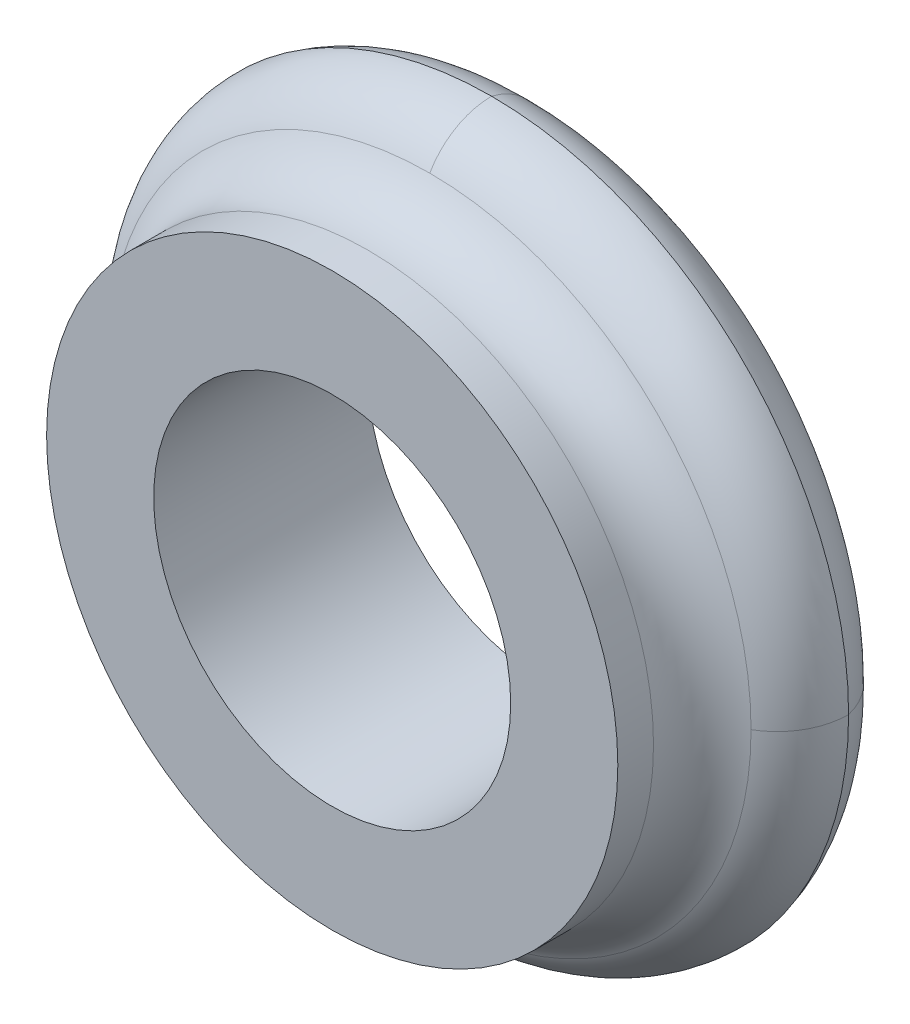
ISO-10303-21;
HEADER;
FILE_DESCRIPTION(('STEP AP214'),'2;1');
FILE_NAME('part.step','',(''),(''),'','','');
FILE_SCHEMA(('AUTOMOTIVE_DESIGN { 1 0 10303 214 1 1 1 1 }'));
ENDSEC;
DATA;
#1=APPLICATION_CONTEXT('core data for automotive mechanical design processes');
#2=APPLICATION_PROTOCOL_DEFINITION('international standard','automotive_design',2000,#1);
#3=PRODUCT_CONTEXT('',#1,'mechanical');
#4=PRODUCT('Part','Part','',(#3));
#5=PRODUCT_RELATED_PRODUCT_CATEGORY('part','',(#4));
#6=PRODUCT_DEFINITION_FORMATION('','',#4);
#7=PRODUCT_DEFINITION_CONTEXT('part definition',#1,'design');
#8=PRODUCT_DEFINITION('design','',#6,#7);
#9=PRODUCT_DEFINITION_SHAPE('','',#8);
#10=(LENGTH_UNIT() NAMED_UNIT(*) SI_UNIT(.MILLI.,.METRE.));
#11=(NAMED_UNIT(*) PLANE_ANGLE_UNIT() SI_UNIT($,.RADIAN.));
#12=(NAMED_UNIT(*) SI_UNIT($,.STERADIAN.) SOLID_ANGLE_UNIT());
#13=UNCERTAINTY_MEASURE_WITH_UNIT(LENGTH_MEASURE(1.E-05),#10,'distance_accuracy_value','');
#14=(GEOMETRIC_REPRESENTATION_CONTEXT(3) GLOBAL_UNCERTAINTY_ASSIGNED_CONTEXT((#13)) GLOBAL_UNIT_ASSIGNED_CONTEXT((#10,
#11,#12)) REPRESENTATION_CONTEXT('',''));
#15=CARTESIAN_POINT('',(0.,0.,0.));
#16=DIRECTION('',(0.,0.,1.));
#17=DIRECTION('',(1.,0.,0.));
#18=AXIS2_PLACEMENT_3D('',#15,#16,#17);
#19=CARTESIAN_POINT('',(0.,0.,3.));
#20=DIRECTION('',(0.,0.,-1.));
#21=DIRECTION('',(-1.,0.,0.));
#22=AXIS2_PLACEMENT_3D('',#19,#20,#21);
#23=CYLINDRICAL_SURFACE('',#22,2.5);
#24=CARTESIAN_POINT('',(0.,0.,3.));
#25=DIRECTION('',(0.,0.,1.));
#26=DIRECTION('',(1.,0.,0.));
#27=AXIS2_PLACEMENT_3D('',#24,#25,#26);
#28=CIRCLE('',#27,2.5);
#29=CARTESIAN_POINT('',(2.5,0.,3.));
#30=VERTEX_POINT('',#29);
#31=EDGE_CURVE('E174',#30,#30,#28,.T.);
#32=ORIENTED_EDGE('',*,*,#31,.T.);
#33=EDGE_LOOP('',(#32));
#34=FACE_BOUND('',#33,.T.);
#35=CARTESIAN_POINT('',(0.,0.,0.));
#36=DIRECTION('',(0.,0.,1.));
#37=DIRECTION('',(1.,0.,0.));
#38=AXIS2_PLACEMENT_3D('',#35,#36,#37);
#39=CIRCLE('',#38,2.5);
#40=CARTESIAN_POINT('',(2.5,0.,0.));
#41=VERTEX_POINT('',#40);
#42=EDGE_CURVE('E139',#41,#41,#39,.T.);
#43=ORIENTED_EDGE('',*,*,#42,.F.);
#44=EDGE_LOOP('',(#43));
#45=FACE_BOUND('',#44,.T.);
#46=ADVANCED_FACE('F41',(#34,#45),#23,.F.);
#47=CARTESIAN_POINT('',(0.,0.,3.));
#48=DIRECTION('',(0.,0.,-1.));
#49=DIRECTION('',(-1.,0.,0.));
#50=AXIS2_PLACEMENT_3D('',#47,#48,#49);
#51=CYLINDRICAL_SURFACE('',#50,4.);
#52=CARTESIAN_POINT('',(0.,0.,2.5));
#53=DIRECTION('',(0.,0.,1.));
#54=DIRECTION('',(1.,0.,0.));
#55=AXIS2_PLACEMENT_3D('',#52,#53,#54);
#56=CIRCLE('',#55,4.);
#57=CARTESIAN_POINT('',(4.,0.,2.5));
#58=VERTEX_POINT('',#57);
#59=EDGE_CURVE('E113',#58,#58,#56,.T.);
#60=ORIENTED_EDGE('',*,*,#59,.T.);
#61=EDGE_LOOP('',(#60));
#62=FACE_BOUND('',#61,.T.);
#63=CARTESIAN_POINT('',(0.,0.,3.));
#64=DIRECTION('',(0.,0.,1.));
#65=DIRECTION('',(1.,0.,0.));
#66=AXIS2_PLACEMENT_3D('',#63,#64,#65);
#67=CIRCLE('',#66,4.);
#68=CARTESIAN_POINT('',(4.,0.,3.));
#69=VERTEX_POINT('',#68);
#70=EDGE_CURVE('E178',#69,#69,#67,.T.);
#71=ORIENTED_EDGE('',*,*,#70,.F.);
#72=EDGE_LOOP('',(#71));
#73=FACE_BOUND('',#72,.T.);
#74=ADVANCED_FACE('F186',(#62,#73),#51,.T.);
#75=CARTESIAN_POINT('',(0.,0.,3.));
#76=DIRECTION('',(0.,0.,1.));
#77=DIRECTION('',(1.,0.,0.));
#78=AXIS2_PLACEMENT_3D('',#75,#76,#77);
#79=PLANE('',#78);
#80=ORIENTED_EDGE('',*,*,#31,.F.);
#81=EDGE_LOOP('',(#80));
#82=FACE_BOUND('',#81,.T.);
#83=ORIENTED_EDGE('',*,*,#70,.T.);
#84=EDGE_LOOP('',(#83));
#85=FACE_BOUND('',#84,.T.);
#86=ADVANCED_FACE('F167',(#82,#85),#79,.T.);
#87=CARTESIAN_POINT('',(0.,0.,0.));
#88=DIRECTION('',(0.,0.,1.));
#89=DIRECTION('',(1.,0.,0.));
#90=AXIS2_PLACEMENT_3D('',#87,#88,#89);
#91=PLANE('',#90);
#92=CARTESIAN_POINT('',(0.,0.,0.));
#93=DIRECTION('',(0.,0.,1.));
#94=DIRECTION('',(1.,0.,0.));
#95=AXIS2_PLACEMENT_3D('',#92,#93,#94);
#96=CIRCLE('',#95,4.02729633355958);
#97=CARTESIAN_POINT('',(0.,4.02729633355958,0.));
#98=VERTEX_POINT('',#97);
#99=CARTESIAN_POINT('',(4.02729633355958,0.,0.));
#100=VERTEX_POINT('',#99);
#101=EDGE_CURVE('E49',#98,#100,#96,.F.);
#102=ORIENTED_EDGE('',*,*,#101,.T.);
#103=CARTESIAN_POINT('',(0.,0.,0.));
#104=DIRECTION('',(0.,0.,1.));
#105=DIRECTION('',(1.,0.,0.));
#106=AXIS2_PLACEMENT_3D('',#103,#104,#105);
#107=CIRCLE('',#106,4.02729633355958);
#108=CARTESIAN_POINT('',(0.,-4.02729633355958,0.));
#109=VERTEX_POINT('',#108);
#110=EDGE_CURVE('E11',#100,#109,#107,.F.);
#111=ORIENTED_EDGE('',*,*,#110,.T.);
#112=CARTESIAN_POINT('',(0.,0.,0.));
#113=DIRECTION('',(0.,0.,1.));
#114=DIRECTION('',(1.,0.,0.));
#115=AXIS2_PLACEMENT_3D('',#112,#113,#114);
#116=CIRCLE('',#115,4.02729633355958);
#117=CARTESIAN_POINT('',(-4.02729633355958,0.,0.));
#118=VERTEX_POINT('',#117);
#119=EDGE_CURVE('E133',#109,#118,#116,.F.);
#120=ORIENTED_EDGE('',*,*,#119,.T.);
#121=CARTESIAN_POINT('',(0.,0.,0.));
#122=DIRECTION('',(0.,0.,1.));
#123=DIRECTION('',(1.,0.,0.));
#124=AXIS2_PLACEMENT_3D('',#121,#122,#123);
#125=CIRCLE('',#124,4.02729633355958);
#126=EDGE_CURVE('E62',#118,#98,#125,.F.);
#127=ORIENTED_EDGE('',*,*,#126,.T.);
#128=EDGE_LOOP('',(#102,#111,#120,#127));
#129=FACE_BOUND('',#128,.T.);
#130=ORIENTED_EDGE('',*,*,#42,.T.);
#131=EDGE_LOOP('',(#130));
#132=FACE_BOUND('',#131,.T.);
#133=ADVANCED_FACE('F170',(#129,#132),#91,.F.);
#134=CARTESIAN_POINT('',(0.,0.,2.5));
#135=DIRECTION('',(0.,0.,1.));
#136=DIRECTION('',(1.,0.,0.));
#137=AXIS2_PLACEMENT_3D('',#134,#135,#136);
#138=TOROIDAL_SURFACE('',#137,5.,1.);
#139=CARTESIAN_POINT('',(0.,0.,1.63397459621555));
#140=DIRECTION('',(0.,0.,1.));
#141=DIRECTION('',(1.,0.,0.));
#142=AXIS2_PLACEMENT_3D('',#139,#140,#141);
#143=CIRCLE('',#142,4.5);
#144=CARTESIAN_POINT('',(-4.5,0.,1.63397459621556));
#145=VERTEX_POINT('',#144);
#146=CARTESIAN_POINT('',(0.,-4.5,1.63397459621556));
#147=VERTEX_POINT('',#146);
#148=EDGE_CURVE('E117',#145,#147,#143,.T.);
#149=ORIENTED_EDGE('',*,*,#148,.T.);
#150=CARTESIAN_POINT('',(0.,0.,1.63397459621556));
#151=DIRECTION('',(0.,0.,1.));
#152=DIRECTION('',(1.,0.,0.));
#153=AXIS2_PLACEMENT_3D('',#150,#151,#152);
#154=CIRCLE('',#153,4.5);
#155=CARTESIAN_POINT('',(4.5,0.,1.63397459621556));
#156=VERTEX_POINT('',#155);
#157=EDGE_CURVE('E100',#147,#156,#154,.T.);
#158=ORIENTED_EDGE('',*,*,#157,.T.);
#159=CARTESIAN_POINT('',(0.,0.,1.63397459621556));
#160=DIRECTION('',(0.,0.,1.));
#161=DIRECTION('',(1.,0.,0.));
#162=AXIS2_PLACEMENT_3D('',#159,#160,#161);
#163=CIRCLE('',#162,4.5);
#164=CARTESIAN_POINT('',(0.,4.5,1.63397459621556));
#165=VERTEX_POINT('',#164);
#166=EDGE_CURVE('E110',#156,#165,#163,.T.);
#167=ORIENTED_EDGE('',*,*,#166,.T.);
#168=CARTESIAN_POINT('',(0.,0.,1.63397459621555));
#169=DIRECTION('',(0.,0.,1.));
#170=DIRECTION('',(1.,0.,0.));
#171=AXIS2_PLACEMENT_3D('',#168,#169,#170);
#172=CIRCLE('',#171,4.5);
#173=EDGE_CURVE('E115',#165,#145,#172,.T.);
#174=ORIENTED_EDGE('',*,*,#173,.T.);
#175=EDGE_LOOP('',(#149,#158,#167,#174));
#176=FACE_BOUND('',#175,.T.);
#177=ORIENTED_EDGE('',*,*,#59,.F.);
#178=EDGE_LOOP('',(#177));
#179=FACE_BOUND('',#178,.T.);
#180=ADVANCED_FACE('F114',(#176,#179),#138,.F.);
#181=CARTESIAN_POINT('',(0.,0.,0.767949192431123));
#182=DIRECTION('',(0.,0.,-1.));
#183=DIRECTION('',(-1.,0.,0.));
#184=AXIS2_PLACEMENT_3D('',#181,#182,#183);
#185=TOROIDAL_SURFACE('',#184,4.,1.);
#186=CARTESIAN_POINT('',(0.,4.,0.767949192431123));
#187=DIRECTION('',(1.,0.,0.));
#188=DIRECTION('',(0.,0.,-1.));
#189=AXIS2_PLACEMENT_3D('',#186,#187,#188);
#190=CIRCLE('',#189,1.);
#191=CARTESIAN_POINT('',(0.,5.,0.767949192431123));
#192=VERTEX_POINT('',#191);
#193=EDGE_CURVE('E107',#192,#165,#190,.T.);
#194=ORIENTED_EDGE('',*,*,#193,.F.);
#195=CARTESIAN_POINT('',(0.,0.,0.767949192431123));
#196=DIRECTION('',(0.,0.,-1.));
#197=DIRECTION('',(-1.,0.,0.));
#198=AXIS2_PLACEMENT_3D('',#195,#196,#197);
#199=CIRCLE('',#198,5.);
#200=CARTESIAN_POINT('',(-5.,0.,0.767949192431123));
#201=VERTEX_POINT('',#200);
#202=EDGE_CURVE('E129',#201,#192,#199,.T.);
#203=ORIENTED_EDGE('',*,*,#202,.F.);
#204=CARTESIAN_POINT('',(-4.,0.,0.767949192431123));
#205=DIRECTION('',(0.,-1.,0.));
#206=DIRECTION('',(0.,0.,-1.));
#207=AXIS2_PLACEMENT_3D('',#204,#205,#206);
#208=CIRCLE('',#207,1.);
#209=EDGE_CURVE('E140',#145,#201,#208,.T.);
#210=ORIENTED_EDGE('',*,*,#209,.F.);
#211=ORIENTED_EDGE('',*,*,#173,.F.);
#212=EDGE_LOOP('',(#194,#203,#210,#211));
#213=FACE_BOUND('',#212,.T.);
#214=ADVANCED_FACE('F157',(#213),#185,.T.);
#215=CARTESIAN_POINT('',(0.,0.,0.767949192431123));
#216=DIRECTION('',(0.,0.,-1.));
#217=DIRECTION('',(-1.,0.,0.));
#218=AXIS2_PLACEMENT_3D('',#215,#216,#217);
#219=TOROIDAL_SURFACE('',#218,4.,1.);
#220=ORIENTED_EDGE('',*,*,#209,.T.);
#221=CARTESIAN_POINT('',(0.,0.,0.767949192431123));
#222=DIRECTION('',(0.,0.,-1.));
#223=DIRECTION('',(-1.,0.,0.));
#224=AXIS2_PLACEMENT_3D('',#221,#222,#223);
#225=CIRCLE('',#224,5.);
#226=CARTESIAN_POINT('',(0.,-5.,0.767949192431123));
#227=VERTEX_POINT('',#226);
#228=EDGE_CURVE('E122',#227,#201,#225,.T.);
#229=ORIENTED_EDGE('',*,*,#228,.F.);
#230=CARTESIAN_POINT('',(0.,-4.,0.767949192431123));
#231=DIRECTION('',(1.,0.,0.));
#232=DIRECTION('',(0.,0.,-1.));
#233=AXIS2_PLACEMENT_3D('',#230,#231,#232);
#234=CIRCLE('',#233,1.);
#235=EDGE_CURVE('E104',#147,#227,#234,.T.);
#236=ORIENTED_EDGE('',*,*,#235,.F.);
#237=ORIENTED_EDGE('',*,*,#148,.F.);
#238=EDGE_LOOP('',(#220,#229,#236,#237));
#239=FACE_BOUND('',#238,.T.);
#240=ADVANCED_FACE('F163',(#239),#219,.T.);
#241=CARTESIAN_POINT('',(0.,0.,0.767949192431123));
#242=DIRECTION('',(0.,0.,-1.));
#243=DIRECTION('',(-1.,0.,0.));
#244=AXIS2_PLACEMENT_3D('',#241,#242,#243);
#245=TOROIDAL_SURFACE('',#244,4.,1.);
#246=ORIENTED_EDGE('',*,*,#193,.T.);
#247=ORIENTED_EDGE('',*,*,#166,.F.);
#248=CARTESIAN_POINT('',(4.,0.,0.767949192431123));
#249=DIRECTION('',(0.,-1.,0.));
#250=DIRECTION('',(0.,0.,-1.));
#251=AXIS2_PLACEMENT_3D('',#248,#249,#250);
#252=CIRCLE('',#251,1.);
#253=CARTESIAN_POINT('',(5.,0.,0.767949192431123));
#254=VERTEX_POINT('',#253);
#255=EDGE_CURVE('E94',#254,#156,#252,.T.);
#256=ORIENTED_EDGE('',*,*,#255,.F.);
#257=CARTESIAN_POINT('',(0.,0.,0.767949192431123));
#258=DIRECTION('',(0.,0.,-1.));
#259=DIRECTION('',(-1.,0.,0.));
#260=AXIS2_PLACEMENT_3D('',#257,#258,#259);
#261=CIRCLE('',#260,5.);
#262=EDGE_CURVE('E131',#192,#254,#261,.T.);
#263=ORIENTED_EDGE('',*,*,#262,.F.);
#264=EDGE_LOOP('',(#246,#247,#256,#263));
#265=FACE_BOUND('',#264,.T.);
#266=ADVANCED_FACE('F108',(#265),#245,.T.);
#267=CARTESIAN_POINT('',(0.,0.,0.767949192431122));
#268=DIRECTION('',(0.,0.,-1.));
#269=DIRECTION('',(-1.,0.,0.));
#270=AXIS2_PLACEMENT_3D('',#267,#268,#269);
#271=TOROIDAL_SURFACE('',#270,4.,1.);
#272=ORIENTED_EDGE('',*,*,#235,.T.);
#273=CARTESIAN_POINT('',(0.,0.,0.767949192431122));
#274=DIRECTION('',(0.,0.,-1.));
#275=DIRECTION('',(-1.,0.,0.));
#276=AXIS2_PLACEMENT_3D('',#273,#274,#275);
#277=CIRCLE('',#276,5.);
#278=EDGE_CURVE('E103',#254,#227,#277,.T.);
#279=ORIENTED_EDGE('',*,*,#278,.F.);
#280=ORIENTED_EDGE('',*,*,#255,.T.);
#281=ORIENTED_EDGE('',*,*,#157,.F.);
#282=EDGE_LOOP('',(#272,#279,#280,#281));
#283=FACE_BOUND('',#282,.T.);
#284=ADVANCED_FACE('F97',(#283),#271,.T.);
#285=CARTESIAN_POINT('',(0.,0.,1.));
#286=DIRECTION('',(0.,0.,-1.));
#287=DIRECTION('',(-1.,0.,0.));
#288=AXIS2_PLACEMENT_3D('',#285,#286,#287);
#289=TOROIDAL_SURFACE('',#288,4.02729633355958,1.);
#290=CARTESIAN_POINT('',(-4.02729633355958,0.,1.));
#291=DIRECTION('',(0.,-1.,0.));
#292=DIRECTION('',(0.,0.,-1.));
#293=AXIS2_PLACEMENT_3D('',#290,#291,#292);
#294=CIRCLE('',#293,1.);
#295=EDGE_CURVE('E150',#201,#118,#294,.T.);
#296=ORIENTED_EDGE('',*,*,#295,.F.);
#297=ORIENTED_EDGE('',*,*,#202,.T.);
#298=CARTESIAN_POINT('',(0.,4.02729633355958,1.));
#299=DIRECTION('',(1.,0.,0.));
#300=DIRECTION('',(0.,0.,-1.));
#301=AXIS2_PLACEMENT_3D('',#298,#299,#300);
#302=CIRCLE('',#301,1.);
#303=EDGE_CURVE('E44',#98,#192,#302,.T.);
#304=ORIENTED_EDGE('',*,*,#303,.F.);
#305=ORIENTED_EDGE('',*,*,#126,.F.);
#306=EDGE_LOOP('',(#296,#297,#304,#305));
#307=FACE_BOUND('',#306,.T.);
#308=ADVANCED_FACE('F43',(#307),#289,.T.);
#309=CARTESIAN_POINT('',(0.,0.,1.));
#310=DIRECTION('',(0.,0.,-1.));
#311=DIRECTION('',(-1.,0.,0.));
#312=AXIS2_PLACEMENT_3D('',#309,#310,#311);
#313=TOROIDAL_SURFACE('',#312,4.02729633355958,1.);
#314=ORIENTED_EDGE('',*,*,#303,.T.);
#315=ORIENTED_EDGE('',*,*,#262,.T.);
#316=CARTESIAN_POINT('',(4.02729633355958,0.,1.));
#317=DIRECTION('',(0.,-1.,0.));
#318=DIRECTION('',(0.,0.,-1.));
#319=AXIS2_PLACEMENT_3D('',#316,#317,#318);
#320=CIRCLE('',#319,1.);
#321=EDGE_CURVE('E147',#100,#254,#320,.T.);
#322=ORIENTED_EDGE('',*,*,#321,.F.);
#323=ORIENTED_EDGE('',*,*,#101,.F.);
#324=EDGE_LOOP('',(#314,#315,#322,#323));
#325=FACE_BOUND('',#324,.T.);
#326=ADVANCED_FACE('F152',(#325),#313,.T.);
#327=CARTESIAN_POINT('',(0.,0.,1.));
#328=DIRECTION('',(0.,0.,-1.));
#329=DIRECTION('',(-1.,0.,0.));
#330=AXIS2_PLACEMENT_3D('',#327,#328,#329);
#331=TOROIDAL_SURFACE('',#330,4.02729633355958,1.);
#332=ORIENTED_EDGE('',*,*,#295,.T.);
#333=ORIENTED_EDGE('',*,*,#119,.F.);
#334=CARTESIAN_POINT('',(0.,-4.02729633355958,1.));
#335=DIRECTION('',(1.,0.,0.));
#336=DIRECTION('',(0.,0.,-1.));
#337=AXIS2_PLACEMENT_3D('',#334,#335,#336);
#338=CIRCLE('',#337,1.);
#339=EDGE_CURVE('E144',#227,#109,#338,.T.);
#340=ORIENTED_EDGE('',*,*,#339,.F.);
#341=ORIENTED_EDGE('',*,*,#228,.T.);
#342=EDGE_LOOP('',(#332,#333,#340,#341));
#343=FACE_BOUND('',#342,.T.);
#344=ADVANCED_FACE('F168',(#343),#331,.T.);
#345=CARTESIAN_POINT('',(0.,0.,1.));
#346=DIRECTION('',(0.,0.,-1.));
#347=DIRECTION('',(-1.,0.,0.));
#348=AXIS2_PLACEMENT_3D('',#345,#346,#347);
#349=TOROIDAL_SURFACE('',#348,4.02729633355958,1.);
#350=ORIENTED_EDGE('',*,*,#321,.T.);
#351=ORIENTED_EDGE('',*,*,#278,.T.);
#352=ORIENTED_EDGE('',*,*,#339,.T.);
#353=ORIENTED_EDGE('',*,*,#110,.F.);
#354=EDGE_LOOP('',(#350,#351,#352,#353));
#355=FACE_BOUND('',#354,.T.);
#356=ADVANCED_FACE('F165',(#355),#349,.T.);
#357=CLOSED_SHELL('',(#46,#74,#86,#133,#180,#214,#240,#266,#284,#308,#326,#344,#356));
#358=MANIFOLD_SOLID_BREP('B2',#357);
#359=ADVANCED_BREP_SHAPE_REPRESENTATION('',(#18,#358),#14);
#360=SHAPE_DEFINITION_REPRESENTATION(#9,#359);
ENDSEC;
END-ISO-10303-21;
